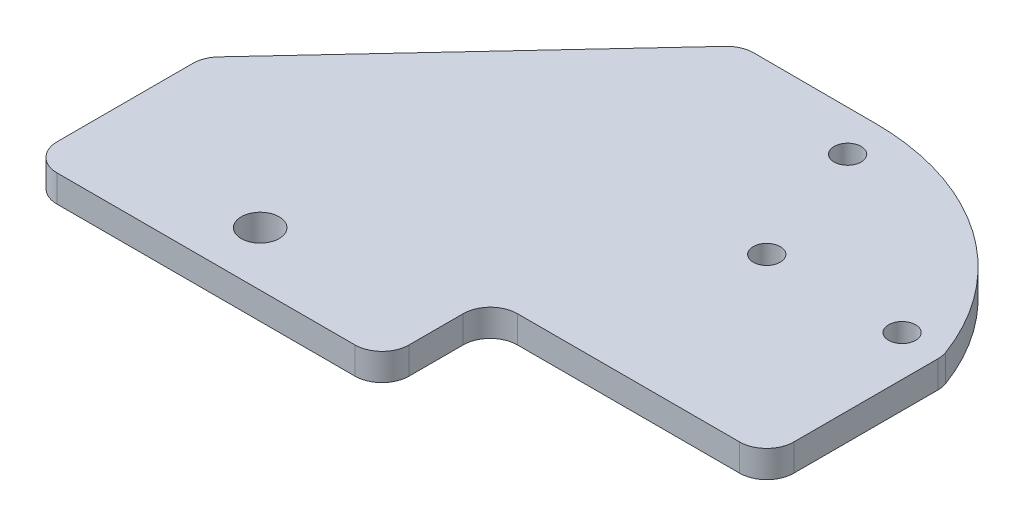
ISO-10303-21;
HEADER;
FILE_DESCRIPTION(('STEP AP214'),'2;1');
FILE_NAME('part.step','',(''),(''),'','','');
FILE_SCHEMA(('AUTOMOTIVE_DESIGN { 1 0 10303 214 1 1 1 1 }'));
ENDSEC;
DATA;
#1=APPLICATION_CONTEXT('core data for automotive mechanical design processes');
#2=APPLICATION_PROTOCOL_DEFINITION('international standard','automotive_design',2000,#1);
#3=PRODUCT_CONTEXT('',#1,'mechanical');
#4=PRODUCT('Part','Part','',(#3));
#5=PRODUCT_RELATED_PRODUCT_CATEGORY('part','',(#4));
#6=PRODUCT_DEFINITION_FORMATION('','',#4);
#7=PRODUCT_DEFINITION_CONTEXT('part definition',#1,'design');
#8=PRODUCT_DEFINITION('design','',#6,#7);
#9=PRODUCT_DEFINITION_SHAPE('','',#8);
#10=(LENGTH_UNIT() NAMED_UNIT(*) SI_UNIT(.MILLI.,.METRE.));
#11=(NAMED_UNIT(*) PLANE_ANGLE_UNIT() SI_UNIT($,.RADIAN.));
#12=(NAMED_UNIT(*) SI_UNIT($,.STERADIAN.) SOLID_ANGLE_UNIT());
#13=UNCERTAINTY_MEASURE_WITH_UNIT(LENGTH_MEASURE(1.E-05),#10,'distance_accuracy_value','');
#14=(GEOMETRIC_REPRESENTATION_CONTEXT(3) GLOBAL_UNCERTAINTY_ASSIGNED_CONTEXT((#13)) GLOBAL_UNIT_ASSIGNED_CONTEXT((#10,
#11,#12)) REPRESENTATION_CONTEXT('',''));
#15=CARTESIAN_POINT('',(0.,0.,0.));
#16=DIRECTION('',(0.,0.,1.));
#17=DIRECTION('',(1.,0.,0.));
#18=AXIS2_PLACEMENT_3D('',#15,#16,#17);
#19=CARTESIAN_POINT('',(-34.7983001151033,10.,-117.080751783085));
#20=DIRECTION('',(0.,-1.,0.));
#21=DIRECTION('',(0.,0.,-1.));
#22=AXIS2_PLACEMENT_3D('',#19,#20,#21);
#23=CYLINDRICAL_SURFACE('',#22,9.99999999999999);
#24=CARTESIAN_POINT('',(-34.7983001151033,0.,-117.080751783085));
#25=DIRECTION('',(0.,1.,0.));
#26=DIRECTION('',(0.,0.,-1.));
#27=AXIS2_PLACEMENT_3D('',#24,#25,#26);
#28=CIRCLE('',#27,9.99999999999999);
#29=CARTESIAN_POINT('',(-34.7740073455693,0.,-127.080722276109));
#30=VERTEX_POINT('',#29);
#31=CARTESIAN_POINT('',(-42.1194135361715,0.,-123.892601625518));
#32=VERTEX_POINT('',#31);
#33=EDGE_CURVE('E181',#30,#32,#28,.T.);
#34=ORIENTED_EDGE('',*,*,#33,.T.);
#35=DIRECTION('',(0.,-1.,0.));
#36=VECTOR('',#35,1.);
#37=CARTESIAN_POINT('',(-42.1194135361715,10.,-123.892601625518));
#38=LINE('',#37,#36);
#39=CARTESIAN_POINT('',(-42.1194135361715,10.,-123.892601625518));
#40=VERTEX_POINT('',#39);
#41=EDGE_CURVE('E11',#40,#32,#38,.T.);
#42=ORIENTED_EDGE('',*,*,#41,.F.);
#43=CARTESIAN_POINT('',(-34.7983001151033,10.,-117.080751783085));
#44=DIRECTION('',(0.,1.,0.));
#45=DIRECTION('',(0.,0.,-1.));
#46=AXIS2_PLACEMENT_3D('',#43,#44,#45);
#47=CIRCLE('',#46,9.99999999999999);
#48=CARTESIAN_POINT('',(-34.7740073455693,10.,-127.080722276109));
#49=VERTEX_POINT('',#48);
#50=EDGE_CURVE('E211',#49,#40,#47,.T.);
#51=ORIENTED_EDGE('',*,*,#50,.F.);
#52=DIRECTION('',(0.,-1.,0.));
#53=VECTOR('',#52,1.);
#54=CARTESIAN_POINT('',(-34.7740073455693,10.,-127.080722276109));
#55=LINE('',#54,#53);
#56=EDGE_CURVE('E177',#49,#30,#55,.T.);
#57=ORIENTED_EDGE('',*,*,#56,.T.);
#58=EDGE_LOOP('',(#34,#42,#51,#57));
#59=FACE_BOUND('',#58,.T.);
#60=ADVANCED_FACE('F35',(#59),#23,.T.);
#61=CARTESIAN_POINT('',(-132.321113421068,10.,-26.9472944173652));
#62=DIRECTION('',(0.732111342106818,0.,0.681184984243307));
#63=DIRECTION('',(0.681184984243307,0.,-0.732111342106818));
#64=AXIS2_PLACEMENT_3D('',#61,#62,#63);
#65=PLANE('',#64);
#66=DIRECTION('',(-0.681184984243307,0.,0.732111342106818));
#67=VECTOR('',#66,1.);
#68=CARTESIAN_POINT('',(-132.321113421068,0.,-26.9472944173652));
#69=LINE('',#68,#67);
#70=CARTESIAN_POINT('',(-132.321113421068,0.,-26.9472944173652));
#71=VERTEX_POINT('',#70);
#72=EDGE_CURVE('E184',#32,#71,#69,.T.);
#73=ORIENTED_EDGE('',*,*,#72,.T.);
#74=DIRECTION('',(0.,-1.,0.));
#75=VECTOR('',#74,1.);
#76=CARTESIAN_POINT('',(-132.321113421068,10.,-26.9472944173652));
#77=LINE('',#76,#75);
#78=CARTESIAN_POINT('',(-132.321113421068,10.,-26.9472944173652));
#79=VERTEX_POINT('',#78);
#80=EDGE_CURVE('E44',#79,#71,#77,.T.);
#81=ORIENTED_EDGE('',*,*,#80,.F.);
#82=DIRECTION('',(-0.681184984243307,0.,0.732111342106818));
#83=VECTOR('',#82,1.);
#84=CARTESIAN_POINT('',(-132.321113421068,10.,-26.9472944173652));
#85=LINE('',#84,#83);
#86=EDGE_CURVE('E120',#40,#79,#85,.T.);
#87=ORIENTED_EDGE('',*,*,#86,.F.);
#88=ORIENTED_EDGE('',*,*,#41,.T.);
#89=EDGE_LOOP('',(#73,#81,#87,#88));
#90=FACE_BOUND('',#89,.T.);
#91=ADVANCED_FACE('F285',(#90),#65,.F.);
#92=CARTESIAN_POINT('',(-125.,10.,-20.1354445749322));
#93=DIRECTION('',(0.,-1.,0.));
#94=DIRECTION('',(0.,0.,-1.));
#95=AXIS2_PLACEMENT_3D('',#92,#93,#94);
#96=CYLINDRICAL_SURFACE('',#95,9.99999999999999);
#97=CARTESIAN_POINT('',(-125.,0.,-20.1354445749322));
#98=DIRECTION('',(0.,1.,0.));
#99=DIRECTION('',(0.,0.,-1.));
#100=AXIS2_PLACEMENT_3D('',#97,#98,#99);
#101=CIRCLE('',#100,9.99999999999999);
#102=CARTESIAN_POINT('',(-135.,0.,-20.1354445749321));
#103=VERTEX_POINT('',#102);
#104=EDGE_CURVE('E186',#71,#103,#101,.T.);
#105=ORIENTED_EDGE('',*,*,#104,.T.);
#106=DIRECTION('',(0.,-1.,0.));
#107=VECTOR('',#106,1.);
#108=CARTESIAN_POINT('',(-135.,10.,-20.1354445749321));
#109=LINE('',#108,#107);
#110=CARTESIAN_POINT('',(-135.,10.,-20.1354445749321));
#111=VERTEX_POINT('',#110);
#112=EDGE_CURVE('E242',#111,#103,#109,.T.);
#113=ORIENTED_EDGE('',*,*,#112,.F.);
#114=CARTESIAN_POINT('',(-125.,10.,-20.1354445749322));
#115=DIRECTION('',(0.,1.,0.));
#116=DIRECTION('',(0.,0.,-1.));
#117=AXIS2_PLACEMENT_3D('',#114,#115,#116);
#118=CIRCLE('',#117,9.99999999999999);
#119=EDGE_CURVE('E421',#79,#111,#118,.T.);
#120=ORIENTED_EDGE('',*,*,#119,.F.);
#121=ORIENTED_EDGE('',*,*,#80,.T.);
#122=EDGE_LOOP('',(#105,#113,#120,#121));
#123=FACE_BOUND('',#122,.T.);
#124=ADVANCED_FACE('F289',(#123),#96,.T.);
#125=CARTESIAN_POINT('',(-135.,10.,30.0000000000002));
#126=DIRECTION('',(1.,0.,0.));
#127=DIRECTION('',(0.,0.,-1.));
#128=AXIS2_PLACEMENT_3D('',#125,#126,#127);
#129=PLANE('',#128);
#130=DIRECTION('',(0.,0.,1.));
#131=VECTOR('',#130,1.);
#132=CARTESIAN_POINT('',(-135.,0.,30.0000000000002));
#133=LINE('',#132,#131);
#134=CARTESIAN_POINT('',(-135.,0.,30.0000000000002));
#135=VERTEX_POINT('',#134);
#136=EDGE_CURVE('E188',#103,#135,#133,.T.);
#137=ORIENTED_EDGE('',*,*,#136,.T.);
#138=DIRECTION('',(0.,-1.,0.));
#139=VECTOR('',#138,1.);
#140=CARTESIAN_POINT('',(-135.,10.,30.0000000000002));
#141=LINE('',#140,#139);
#142=CARTESIAN_POINT('',(-135.,10.,30.0000000000002));
#143=VERTEX_POINT('',#142);
#144=EDGE_CURVE('E239',#143,#135,#141,.T.);
#145=ORIENTED_EDGE('',*,*,#144,.F.);
#146=DIRECTION('',(0.,0.,1.));
#147=VECTOR('',#146,1.);
#148=CARTESIAN_POINT('',(-135.,10.,30.0000000000002));
#149=LINE('',#148,#147);
#150=EDGE_CURVE('E423',#111,#143,#149,.T.);
#151=ORIENTED_EDGE('',*,*,#150,.F.);
#152=ORIENTED_EDGE('',*,*,#112,.T.);
#153=EDGE_LOOP('',(#137,#145,#151,#152));
#154=FACE_BOUND('',#153,.T.);
#155=ADVANCED_FACE('F293',(#154),#129,.F.);
#156=CARTESIAN_POINT('',(-125.,10.,30.0000000000002));
#157=DIRECTION('',(0.,-1.,0.));
#158=DIRECTION('',(0.,0.,-1.));
#159=AXIS2_PLACEMENT_3D('',#156,#157,#158);
#160=CYLINDRICAL_SURFACE('',#159,10.);
#161=CARTESIAN_POINT('',(-125.,0.,30.0000000000002));
#162=DIRECTION('',(0.,1.,0.));
#163=DIRECTION('',(0.,0.,-1.));
#164=AXIS2_PLACEMENT_3D('',#161,#162,#163);
#165=CIRCLE('',#164,10.);
#166=CARTESIAN_POINT('',(-125.,0.,40.0000000000002));
#167=VERTEX_POINT('',#166);
#168=EDGE_CURVE('E190',#135,#167,#165,.T.);
#169=ORIENTED_EDGE('',*,*,#168,.T.);
#170=DIRECTION('',(0.,-1.,0.));
#171=VECTOR('',#170,1.);
#172=CARTESIAN_POINT('',(-125.,10.,40.0000000000002));
#173=LINE('',#172,#171);
#174=CARTESIAN_POINT('',(-125.,10.,40.0000000000002));
#175=VERTEX_POINT('',#174);
#176=EDGE_CURVE('E236',#175,#167,#173,.T.);
#177=ORIENTED_EDGE('',*,*,#176,.F.);
#178=CARTESIAN_POINT('',(-125.,10.,30.0000000000002));
#179=DIRECTION('',(0.,1.,0.));
#180=DIRECTION('',(0.,0.,-1.));
#181=AXIS2_PLACEMENT_3D('',#178,#179,#180);
#182=CIRCLE('',#181,10.);
#183=EDGE_CURVE('E425',#143,#175,#182,.T.);
#184=ORIENTED_EDGE('',*,*,#183,.F.);
#185=ORIENTED_EDGE('',*,*,#144,.T.);
#186=EDGE_LOOP('',(#169,#177,#184,#185));
#187=FACE_BOUND('',#186,.T.);
#188=ADVANCED_FACE('F299',(#187),#160,.T.);
#189=CARTESIAN_POINT('',(-15.0000000000001,10.,40.0000000000002));
#190=DIRECTION('',(0.,0.,-1.));
#191=DIRECTION('',(-1.,0.,0.));
#192=AXIS2_PLACEMENT_3D('',#189,#190,#191);
#193=PLANE('',#192);
#194=DIRECTION('',(1.,0.,0.));
#195=VECTOR('',#194,1.);
#196=CARTESIAN_POINT('',(-15.0000000000001,0.,40.0000000000002));
#197=LINE('',#196,#195);
#198=CARTESIAN_POINT('',(-15.0000000000001,0.,40.0000000000002));
#199=VERTEX_POINT('',#198);
#200=EDGE_CURVE('E192',#167,#199,#197,.T.);
#201=ORIENTED_EDGE('',*,*,#200,.T.);
#202=DIRECTION('',(0.,-1.,0.));
#203=VECTOR('',#202,1.);
#204=CARTESIAN_POINT('',(-15.0000000000001,10.,40.0000000000002));
#205=LINE('',#204,#203);
#206=CARTESIAN_POINT('',(-15.0000000000001,10.,40.0000000000002));
#207=VERTEX_POINT('',#206);
#208=EDGE_CURVE('E233',#207,#199,#205,.T.);
#209=ORIENTED_EDGE('',*,*,#208,.F.);
#210=DIRECTION('',(1.,0.,0.));
#211=VECTOR('',#210,1.);
#212=CARTESIAN_POINT('',(-15.0000000000001,10.,40.0000000000002));
#213=LINE('',#212,#211);
#214=EDGE_CURVE('E427',#175,#207,#213,.T.);
#215=ORIENTED_EDGE('',*,*,#214,.F.);
#216=ORIENTED_EDGE('',*,*,#176,.T.);
#217=EDGE_LOOP('',(#201,#209,#215,#216));
#218=FACE_BOUND('',#217,.T.);
#219=ADVANCED_FACE('F303',(#218),#193,.F.);
#220=CARTESIAN_POINT('',(-15.0000000000001,10.,30.0000000000002));
#221=DIRECTION('',(0.,-1.,0.));
#222=DIRECTION('',(0.,0.,-1.));
#223=AXIS2_PLACEMENT_3D('',#220,#221,#222);
#224=CYLINDRICAL_SURFACE('',#223,10.);
#225=CARTESIAN_POINT('',(-15.0000000000001,0.,30.0000000000002));
#226=DIRECTION('',(0.,1.,0.));
#227=DIRECTION('',(0.,0.,1.));
#228=AXIS2_PLACEMENT_3D('',#225,#226,#227);
#229=CIRCLE('',#228,10.);
#230=CARTESIAN_POINT('',(-5.00000000000007,0.,30.0000000000002));
#231=VERTEX_POINT('',#230);
#232=EDGE_CURVE('E194',#199,#231,#229,.T.);
#233=ORIENTED_EDGE('',*,*,#232,.T.);
#234=DIRECTION('',(0.,-1.,0.));
#235=VECTOR('',#234,1.);
#236=CARTESIAN_POINT('',(-5.00000000000007,10.,30.0000000000002));
#237=LINE('',#236,#235);
#238=CARTESIAN_POINT('',(-5.00000000000007,10.,30.0000000000002));
#239=VERTEX_POINT('',#238);
#240=EDGE_CURVE('E230',#239,#231,#237,.T.);
#241=ORIENTED_EDGE('',*,*,#240,.F.);
#242=CARTESIAN_POINT('',(-15.0000000000001,10.,30.0000000000002));
#243=DIRECTION('',(0.,1.,0.));
#244=DIRECTION('',(0.,0.,1.));
#245=AXIS2_PLACEMENT_3D('',#242,#243,#244);
#246=CIRCLE('',#245,10.);
#247=EDGE_CURVE('E429',#207,#239,#246,.T.);
#248=ORIENTED_EDGE('',*,*,#247,.F.);
#249=ORIENTED_EDGE('',*,*,#208,.T.);
#250=EDGE_LOOP('',(#233,#241,#248,#249));
#251=FACE_BOUND('',#250,.T.);
#252=ADVANCED_FACE('F307',(#251),#224,.T.);
#253=CARTESIAN_POINT('',(-5.00000000000007,10.,10.0000000000001));
#254=DIRECTION('',(-1.,0.,0.));
#255=DIRECTION('',(0.,0.,1.));
#256=AXIS2_PLACEMENT_3D('',#253,#254,#255);
#257=PLANE('',#256);
#258=DIRECTION('',(0.,0.,-1.));
#259=VECTOR('',#258,1.);
#260=CARTESIAN_POINT('',(-5.00000000000007,0.,10.0000000000001));
#261=LINE('',#260,#259);
#262=CARTESIAN_POINT('',(-5.00000000000007,0.,10.0000000000001));
#263=VERTEX_POINT('',#262);
#264=EDGE_CURVE('E196',#231,#263,#261,.T.);
#265=ORIENTED_EDGE('',*,*,#264,.T.);
#266=DIRECTION('',(0.,-1.,0.));
#267=VECTOR('',#266,1.);
#268=CARTESIAN_POINT('',(-5.00000000000007,10.,10.0000000000001));
#269=LINE('',#268,#267);
#270=CARTESIAN_POINT('',(-5.00000000000007,10.,10.0000000000001));
#271=VERTEX_POINT('',#270);
#272=EDGE_CURVE('E227',#271,#263,#269,.T.);
#273=ORIENTED_EDGE('',*,*,#272,.F.);
#274=DIRECTION('',(0.,0.,-1.));
#275=VECTOR('',#274,1.);
#276=CARTESIAN_POINT('',(-5.00000000000007,10.,10.0000000000001));
#277=LINE('',#276,#275);
#278=EDGE_CURVE('E431',#239,#271,#277,.T.);
#279=ORIENTED_EDGE('',*,*,#278,.F.);
#280=ORIENTED_EDGE('',*,*,#240,.T.);
#281=EDGE_LOOP('',(#265,#273,#279,#280));
#282=FACE_BOUND('',#281,.T.);
#283=ADVANCED_FACE('F311',(#282),#257,.F.);
#284=CARTESIAN_POINT('',(4.99999999999992,10.,10.));
#285=DIRECTION('',(0.,-1.,0.));
#286=DIRECTION('',(0.,0.,-1.));
#287=AXIS2_PLACEMENT_3D('',#284,#285,#286);
#288=CYLINDRICAL_SURFACE('',#287,10.);
#289=CARTESIAN_POINT('',(4.99999999999992,0.,10.));
#290=DIRECTION('',(0.,-1.,0.));
#291=DIRECTION('',(0.,0.,-1.));
#292=AXIS2_PLACEMENT_3D('',#289,#290,#291);
#293=CIRCLE('',#292,10.);
#294=CARTESIAN_POINT('',(4.99999999999992,0.,0.));
#295=VERTEX_POINT('',#294);
#296=EDGE_CURVE('E198',#263,#295,#293,.T.);
#297=ORIENTED_EDGE('',*,*,#296,.T.);
#298=DIRECTION('',(0.,-1.,0.));
#299=VECTOR('',#298,1.);
#300=CARTESIAN_POINT('',(4.99999999999992,10.,0.));
#301=LINE('',#300,#299);
#302=CARTESIAN_POINT('',(4.99999999999992,10.,0.));
#303=VERTEX_POINT('',#302);
#304=EDGE_CURVE('E224',#303,#295,#301,.T.);
#305=ORIENTED_EDGE('',*,*,#304,.F.);
#306=CARTESIAN_POINT('',(4.99999999999992,10.,10.));
#307=DIRECTION('',(0.,-1.,0.));
#308=DIRECTION('',(0.,0.,-1.));
#309=AXIS2_PLACEMENT_3D('',#306,#307,#308);
#310=CIRCLE('',#309,10.);
#311=EDGE_CURVE('E433',#271,#303,#310,.T.);
#312=ORIENTED_EDGE('',*,*,#311,.F.);
#313=ORIENTED_EDGE('',*,*,#272,.T.);
#314=EDGE_LOOP('',(#297,#305,#312,#313));
#315=FACE_BOUND('',#314,.T.);
#316=ADVANCED_FACE('F315',(#315),#288,.F.);
#317=CARTESIAN_POINT('',(5.,10.,0.));
#318=DIRECTION('',(0.,0.,-1.));
#319=DIRECTION('',(-1.,0.,0.));
#320=AXIS2_PLACEMENT_3D('',#317,#318,#319);
#321=PLANE('',#320);
#322=DIRECTION('',(1.,0.,0.));
#323=VECTOR('',#322,1.);
#324=CARTESIAN_POINT('',(5.,0.,0.));
#325=LINE('',#324,#323);
#326=CARTESIAN_POINT('',(87.0999999999999,0.,0.));
#327=VERTEX_POINT('',#326);
#328=EDGE_CURVE('E200',#295,#327,#325,.T.);
#329=ORIENTED_EDGE('',*,*,#328,.T.);
#330=DIRECTION('',(0.,-1.,0.));
#331=VECTOR('',#330,1.);
#332=CARTESIAN_POINT('',(87.0999999999999,10.,0.));
#333=LINE('',#332,#331);
#334=CARTESIAN_POINT('',(87.0999999999999,10.,0.));
#335=VERTEX_POINT('',#334);
#336=EDGE_CURVE('E221',#335,#327,#333,.T.);
#337=ORIENTED_EDGE('',*,*,#336,.F.);
#338=DIRECTION('',(1.,0.,0.));
#339=VECTOR('',#338,1.);
#340=CARTESIAN_POINT('',(5.,10.,0.));
#341=LINE('',#340,#339);
#342=EDGE_CURVE('E435',#303,#335,#341,.T.);
#343=ORIENTED_EDGE('',*,*,#342,.F.);
#344=ORIENTED_EDGE('',*,*,#304,.T.);
#345=EDGE_LOOP('',(#329,#337,#343,#344));
#346=FACE_BOUND('',#345,.T.);
#347=ADVANCED_FACE('F319',(#346),#321,.F.);
#348=CARTESIAN_POINT('',(87.1,10.,-10.));
#349=DIRECTION('',(0.,-1.,0.));
#350=DIRECTION('',(0.,0.,-1.));
#351=AXIS2_PLACEMENT_3D('',#348,#349,#350);
#352=CYLINDRICAL_SURFACE('',#351,10.);
#353=CARTESIAN_POINT('',(87.1,0.,-10.));
#354=DIRECTION('',(0.,1.,0.));
#355=DIRECTION('',(0.,0.,1.));
#356=AXIS2_PLACEMENT_3D('',#353,#354,#355);
#357=CIRCLE('',#356,10.);
#358=CARTESIAN_POINT('',(97.1,0.,-10.0000000000001));
#359=VERTEX_POINT('',#358);
#360=EDGE_CURVE('E202',#327,#359,#357,.T.);
#361=ORIENTED_EDGE('',*,*,#360,.T.);
#362=DIRECTION('',(0.,-1.,0.));
#363=VECTOR('',#362,1.);
#364=CARTESIAN_POINT('',(97.1,10.,-10.0000000000001));
#365=LINE('',#364,#363);
#366=CARTESIAN_POINT('',(97.1,10.,-10.0000000000001));
#367=VERTEX_POINT('',#366);
#368=EDGE_CURVE('E218',#367,#359,#365,.T.);
#369=ORIENTED_EDGE('',*,*,#368,.F.);
#370=CARTESIAN_POINT('',(87.1,10.,-10.));
#371=DIRECTION('',(0.,1.,0.));
#372=DIRECTION('',(0.,0.,1.));
#373=AXIS2_PLACEMENT_3D('',#370,#371,#372);
#374=CIRCLE('',#373,10.);
#375=EDGE_CURVE('E437',#335,#367,#374,.T.);
#376=ORIENTED_EDGE('',*,*,#375,.F.);
#377=ORIENTED_EDGE('',*,*,#336,.T.);
#378=EDGE_LOOP('',(#361,#369,#376,#377));
#379=FACE_BOUND('',#378,.T.);
#380=ADVANCED_FACE('F323',(#379),#352,.T.);
#381=CARTESIAN_POINT('',(97.1,10.,-10.0000000000001));
#382=DIRECTION('',(-1.,0.,0.));
#383=DIRECTION('',(0.,0.,1.));
#384=AXIS2_PLACEMENT_3D('',#381,#382,#383);
#385=PLANE('',#384);
#386=DIRECTION('',(0.,0.,-1.));
#387=VECTOR('',#386,1.);
#388=CARTESIAN_POINT('',(97.1,0.,-10.0000000000001));
#389=LINE('',#388,#387);
#390=CARTESIAN_POINT('',(97.1,0.,-63.2667994650932));
#391=VERTEX_POINT('',#390);
#392=EDGE_CURVE('E204',#359,#391,#389,.T.);
#393=ORIENTED_EDGE('',*,*,#392,.T.);
#394=DIRECTION('',(0.,-1.,0.));
#395=VECTOR('',#394,1.);
#396=CARTESIAN_POINT('',(97.1,10.,-63.2667994650932));
#397=LINE('',#396,#395);
#398=CARTESIAN_POINT('',(97.1,10.,-63.2667994650932));
#399=VERTEX_POINT('',#398);
#400=EDGE_CURVE('E215',#399,#391,#397,.T.);
#401=ORIENTED_EDGE('',*,*,#400,.F.);
#402=DIRECTION('',(0.,0.,-1.));
#403=VECTOR('',#402,1.);
#404=CARTESIAN_POINT('',(97.1,10.,-10.0000000000001));
#405=LINE('',#404,#403);
#406=EDGE_CURVE('E439',#367,#399,#405,.T.);
#407=ORIENTED_EDGE('',*,*,#406,.F.);
#408=ORIENTED_EDGE('',*,*,#368,.T.);
#409=EDGE_LOOP('',(#393,#401,#407,#408));
#410=FACE_BOUND('',#409,.T.);
#411=ADVANCED_FACE('F327',(#410),#385,.F.);
#412=CARTESIAN_POINT('',(87.1,10.,-63.2667994650932));
#413=DIRECTION('',(0.,-1.,0.));
#414=DIRECTION('',(0.,0.,-1.));
#415=AXIS2_PLACEMENT_3D('',#412,#413,#414);
#416=CYLINDRICAL_SURFACE('',#415,9.99999999999999);
#417=CARTESIAN_POINT('',(87.1,0.,-63.2667994650932));
#418=DIRECTION('',(0.,1.,0.));
#419=DIRECTION('',(0.,0.,-1.));
#420=AXIS2_PLACEMENT_3D('',#417,#418,#419);
#421=CIRCLE('',#420,9.99999999999999);
#422=CARTESIAN_POINT('',(96.4817618721916,0.,-66.7283806317701));
#423=VERTEX_POINT('',#422);
#424=EDGE_CURVE('E206',#391,#423,#421,.T.);
#425=ORIENTED_EDGE('',*,*,#424,.T.);
#426=DIRECTION('',(0.,-1.,0.));
#427=VECTOR('',#426,1.);
#428=CARTESIAN_POINT('',(96.4817618721916,10.,-66.7283806317701));
#429=LINE('',#428,#427);
#430=CARTESIAN_POINT('',(96.4817618721916,10.,-66.7283806317701));
#431=VERTEX_POINT('',#430);
#432=EDGE_CURVE('E172',#431,#423,#429,.T.);
#433=ORIENTED_EDGE('',*,*,#432,.F.);
#434=CARTESIAN_POINT('',(87.1,10.,-63.2667994650932));
#435=DIRECTION('',(0.,1.,0.));
#436=DIRECTION('',(0.,0.,-1.));
#437=AXIS2_PLACEMENT_3D('',#434,#435,#436);
#438=CIRCLE('',#437,9.99999999999999);
#439=EDGE_CURVE('E163',#399,#431,#438,.T.);
#440=ORIENTED_EDGE('',*,*,#439,.F.);
#441=ORIENTED_EDGE('',*,*,#400,.T.);
#442=EDGE_LOOP('',(#425,#433,#440,#441));
#443=FACE_BOUND('',#442,.T.);
#444=ADVANCED_FACE('F331',(#443),#416,.T.);
#445=CARTESIAN_POINT('',(9.99999999999992,10.,-34.8192741935483));
#446=DIRECTION('',(0.,-1.,0.));
#447=DIRECTION('',(0.,0.,-1.));
#448=AXIS2_PLACEMENT_3D('',#445,#446,#447);
#449=CYLINDRICAL_SURFACE('',#448,92.1807258064517);
#450=CARTESIAN_POINT('',(9.99999999999992,0.,-34.8192741935483));
#451=DIRECTION('',(0.,1.,0.));
#452=DIRECTION('',(0.,0.,-1.));
#453=AXIS2_PLACEMENT_3D('',#450,#451,#452);
#454=CIRCLE('',#453,92.1807258064517);
#455=CARTESIAN_POINT('',(9.99999999999993,0.,-127.));
#456=VERTEX_POINT('',#455);
#457=EDGE_CURVE('E171',#423,#456,#454,.T.);
#458=ORIENTED_EDGE('',*,*,#457,.T.);
#459=DIRECTION('',(0.,-1.,0.));
#460=VECTOR('',#459,1.);
#461=CARTESIAN_POINT('',(9.99999999999993,10.,-127.));
#462=LINE('',#461,#460);
#463=CARTESIAN_POINT('',(9.99999999999993,10.,-127.));
#464=VERTEX_POINT('',#463);
#465=EDGE_CURVE('E168',#464,#456,#462,.T.);
#466=ORIENTED_EDGE('',*,*,#465,.F.);
#467=CARTESIAN_POINT('',(9.99999999999992,10.,-34.8192741935483));
#468=DIRECTION('',(0.,1.,0.));
#469=DIRECTION('',(0.,0.,-1.));
#470=AXIS2_PLACEMENT_3D('',#467,#468,#469);
#471=CIRCLE('',#470,92.1807258064517);
#472=EDGE_CURVE('E157',#431,#464,#471,.T.);
#473=ORIENTED_EDGE('',*,*,#472,.F.);
#474=ORIENTED_EDGE('',*,*,#432,.T.);
#475=EDGE_LOOP('',(#458,#466,#473,#474));
#476=FACE_BOUND('',#475,.T.);
#477=ADVANCED_FACE('F169',(#476),#449,.T.);
#478=CARTESIAN_POINT('',(-1.54517445824721,10.,-127.));
#479=DIRECTION('',(0.,0.,1.));
#480=DIRECTION('',(1.,0.,0.));
#481=AXIS2_PLACEMENT_3D('',#478,#479,#480);
#482=PLANE('',#481);
#483=DIRECTION('',(-1.,0.,0.));
#484=VECTOR('',#483,1.);
#485=CARTESIAN_POINT('',(-1.54517445824721,0.,-127.));
#486=LINE('',#485,#484);
#487=CARTESIAN_POINT('',(-1.54517445824721,0.,-127.));
#488=VERTEX_POINT('',#487);
#489=EDGE_CURVE('E106',#456,#488,#486,.T.);
#490=ORIENTED_EDGE('',*,*,#489,.T.);
#491=DIRECTION('',(0.,-1.,0.));
#492=VECTOR('',#491,1.);
#493=CARTESIAN_POINT('',(-1.54517445824721,10.,-127.));
#494=LINE('',#493,#492);
#495=CARTESIAN_POINT('',(-1.54517445824721,10.,-127.));
#496=VERTEX_POINT('',#495);
#497=EDGE_CURVE('E173',#496,#488,#494,.T.);
#498=ORIENTED_EDGE('',*,*,#497,.F.);
#499=DIRECTION('',(-1.,0.,0.));
#500=VECTOR('',#499,1.);
#501=CARTESIAN_POINT('',(-1.54517445824721,10.,-127.));
#502=LINE('',#501,#500);
#503=EDGE_CURVE('E161',#464,#496,#502,.T.);
#504=ORIENTED_EDGE('',*,*,#503,.F.);
#505=ORIENTED_EDGE('',*,*,#465,.T.);
#506=EDGE_LOOP('',(#490,#498,#504,#505));
#507=FACE_BOUND('',#506,.T.);
#508=ADVANCED_FACE('F175',(#507),#482,.F.);
#509=CARTESIAN_POINT('',(-34.7740073455693,10.,-127.080722276109));
#510=DIRECTION('',(-0.0024292769534094,0.,0.999997049302389));
#511=DIRECTION('',(0.999997049302389,0.,0.0024292769534094));
#512=AXIS2_PLACEMENT_3D('',#509,#510,#511);
#513=PLANE('',#512);
#514=DIRECTION('',(-0.999997049302389,0.,-0.0024292769534094));
#515=VECTOR('',#514,1.);
#516=CARTESIAN_POINT('',(-34.7740073455693,0.,-127.080722276109));
#517=LINE('',#516,#515);
#518=EDGE_CURVE('E112',#488,#30,#517,.T.);
#519=ORIENTED_EDGE('',*,*,#518,.T.);
#520=ORIENTED_EDGE('',*,*,#56,.F.);
#521=DIRECTION('',(-0.999997049302389,0.,-0.0024292769534094));
#522=VECTOR('',#521,1.);
#523=CARTESIAN_POINT('',(-34.7740073455693,10.,-127.080722276109));
#524=LINE('',#523,#522);
#525=EDGE_CURVE('E53',#496,#49,#524,.T.);
#526=ORIENTED_EDGE('',*,*,#525,.F.);
#527=ORIENTED_EDGE('',*,*,#497,.T.);
#528=EDGE_LOOP('',(#519,#520,#526,#527));
#529=FACE_BOUND('',#528,.T.);
#530=ADVANCED_FACE('F274',(#529),#513,.F.);
#531=CARTESIAN_POINT('',(-34.7983001151033,10.,-117.080751783085));
#532=DIRECTION('',(0.,-1.,0.));
#533=DIRECTION('',(0.,0.,-1.));
#534=AXIS2_PLACEMENT_3D('',#531,#532,#533);
#535=PLANE('',#534);
#536=CARTESIAN_POINT('',(-70.0000000000001,10.,20.0000000000002));
#537=DIRECTION('',(0.,-1.,0.));
#538=DIRECTION('',(0.,0.,-1.));
#539=AXIS2_PLACEMENT_3D('',#536,#537,#538);
#540=CIRCLE('',#539,7.);
#541=CARTESIAN_POINT('',(-70.0000000000001,10.,13.0000000000002));
#542=VERTEX_POINT('',#541);
#543=EDGE_CURVE('E404',#542,#542,#540,.T.);
#544=ORIENTED_EDGE('',*,*,#543,.T.);
#545=EDGE_LOOP('',(#544));
#546=FACE_BOUND('',#545,.T.);
#547=CARTESIAN_POINT('',(14.9989928337167,10.,-111.984631039295));
#548=DIRECTION('',(0.,1.,0.));
#549=DIRECTION('',(0.,0.,1.));
#550=AXIS2_PLACEMENT_3D('',#547,#548,#549);
#551=CIRCLE('',#550,5.00000000000001);
#552=CARTESIAN_POINT('',(14.9989928337167,10.,-106.984631039295));
#553=VERTEX_POINT('',#552);
#554=EDGE_CURVE('E250',#553,#553,#551,.T.);
#555=ORIENTED_EDGE('',*,*,#554,.F.);
#556=EDGE_LOOP('',(#555));
#557=FACE_BOUND('',#556,.T.);
#558=CARTESIAN_POINT('',(82.1,10.,-65.));
#559=DIRECTION('',(0.,1.,0.));
#560=DIRECTION('',(0.,0.,1.));
#561=AXIS2_PLACEMENT_3D('',#558,#559,#560);
#562=CIRCLE('',#561,5.00000000000001);
#563=CARTESIAN_POINT('',(82.1,10.,-60.));
#564=VERTEX_POINT('',#563);
#565=EDGE_CURVE('E414',#564,#564,#562,.T.);
#566=ORIENTED_EDGE('',*,*,#565,.F.);
#567=EDGE_LOOP('',(#566));
#568=FACE_BOUND('',#567,.T.);
#569=CARTESIAN_POINT('',(32.1,10.,-65.));
#570=DIRECTION('',(0.,1.,0.));
#571=DIRECTION('',(0.,0.,1.));
#572=AXIS2_PLACEMENT_3D('',#569,#570,#571);
#573=CIRCLE('',#572,4.99999999999999);
#574=CARTESIAN_POINT('',(32.1,10.,-60.));
#575=VERTEX_POINT('',#574);
#576=EDGE_CURVE('E409',#575,#575,#573,.T.);
#577=ORIENTED_EDGE('',*,*,#576,.F.);
#578=EDGE_LOOP('',(#577));
#579=FACE_BOUND('',#578,.T.);
#580=ORIENTED_EDGE('',*,*,#50,.T.);
#581=ORIENTED_EDGE('',*,*,#86,.T.);
#582=ORIENTED_EDGE('',*,*,#119,.T.);
#583=ORIENTED_EDGE('',*,*,#150,.T.);
#584=ORIENTED_EDGE('',*,*,#183,.T.);
#585=ORIENTED_EDGE('',*,*,#214,.T.);
#586=ORIENTED_EDGE('',*,*,#247,.T.);
#587=ORIENTED_EDGE('',*,*,#278,.T.);
#588=ORIENTED_EDGE('',*,*,#311,.T.);
#589=ORIENTED_EDGE('',*,*,#342,.T.);
#590=ORIENTED_EDGE('',*,*,#375,.T.);
#591=ORIENTED_EDGE('',*,*,#406,.T.);
#592=ORIENTED_EDGE('',*,*,#439,.T.);
#593=ORIENTED_EDGE('',*,*,#472,.T.);
#594=ORIENTED_EDGE('',*,*,#503,.T.);
#595=ORIENTED_EDGE('',*,*,#525,.T.);
#596=EDGE_LOOP('',(#580,#581,#582,#583,#584,#585,#586,#587,#588,#589,#590,#591,#592,#593,#594,#595));
#597=FACE_BOUND('',#596,.T.);
#598=ADVANCED_FACE('F159',(#546,#557,#568,#579,#597),#535,.F.);
#599=CARTESIAN_POINT('',(-34.7983001151033,0.,-117.080751783085));
#600=DIRECTION('',(0.,-1.,0.));
#601=DIRECTION('',(0.,0.,-1.));
#602=AXIS2_PLACEMENT_3D('',#599,#600,#601);
#603=PLANE('',#602);
#604=CARTESIAN_POINT('',(-70.0000000000001,0.,20.0000000000002));
#605=DIRECTION('',(0.,-1.,0.));
#606=DIRECTION('',(0.,0.,-1.));
#607=AXIS2_PLACEMENT_3D('',#604,#605,#606);
#608=CIRCLE('',#607,7.);
#609=CARTESIAN_POINT('',(-70.0000000000001,0.,13.0000000000002));
#610=VERTEX_POINT('',#609);
#611=EDGE_CURVE('E407',#610,#610,#608,.T.);
#612=ORIENTED_EDGE('',*,*,#611,.F.);
#613=EDGE_LOOP('',(#612));
#614=FACE_BOUND('',#613,.T.);
#615=CARTESIAN_POINT('',(14.9989928337167,0.,-111.984631039295));
#616=DIRECTION('',(0.,-1.,0.));
#617=DIRECTION('',(0.,0.,-1.));
#618=AXIS2_PLACEMENT_3D('',#615,#616,#617);
#619=CIRCLE('',#618,5.00000000000001);
#620=CARTESIAN_POINT('',(14.9989928337167,0.,-106.984631039295));
#621=VERTEX_POINT('',#620);
#622=EDGE_CURVE('E38',#621,#621,#619,.T.);
#623=ORIENTED_EDGE('',*,*,#622,.F.);
#624=EDGE_LOOP('',(#623));
#625=FACE_BOUND('',#624,.T.);
#626=CARTESIAN_POINT('',(82.1,0.,-65.));
#627=DIRECTION('',(0.,-1.,0.));
#628=DIRECTION('',(0.,0.,-1.));
#629=AXIS2_PLACEMENT_3D('',#626,#627,#628);
#630=CIRCLE('',#629,5.00000000000001);
#631=CARTESIAN_POINT('',(82.1,0.,-60.));
#632=VERTEX_POINT('',#631);
#633=EDGE_CURVE('E249',#632,#632,#630,.T.);
#634=ORIENTED_EDGE('',*,*,#633,.F.);
#635=EDGE_LOOP('',(#634));
#636=FACE_BOUND('',#635,.T.);
#637=CARTESIAN_POINT('',(32.1,0.,-65.));
#638=DIRECTION('',(0.,-1.,0.));
#639=DIRECTION('',(0.,0.,-1.));
#640=AXIS2_PLACEMENT_3D('',#637,#638,#639);
#641=CIRCLE('',#640,4.99999999999999);
#642=CARTESIAN_POINT('',(32.1,0.,-60.));
#643=VERTEX_POINT('',#642);
#644=EDGE_CURVE('E247',#643,#643,#641,.T.);
#645=ORIENTED_EDGE('',*,*,#644,.F.);
#646=EDGE_LOOP('',(#645));
#647=FACE_BOUND('',#646,.T.);
#648=ORIENTED_EDGE('',*,*,#33,.F.);
#649=ORIENTED_EDGE('',*,*,#518,.F.);
#650=ORIENTED_EDGE('',*,*,#489,.F.);
#651=ORIENTED_EDGE('',*,*,#457,.F.);
#652=ORIENTED_EDGE('',*,*,#424,.F.);
#653=ORIENTED_EDGE('',*,*,#392,.F.);
#654=ORIENTED_EDGE('',*,*,#360,.F.);
#655=ORIENTED_EDGE('',*,*,#328,.F.);
#656=ORIENTED_EDGE('',*,*,#296,.F.);
#657=ORIENTED_EDGE('',*,*,#264,.F.);
#658=ORIENTED_EDGE('',*,*,#232,.F.);
#659=ORIENTED_EDGE('',*,*,#200,.F.);
#660=ORIENTED_EDGE('',*,*,#168,.F.);
#661=ORIENTED_EDGE('',*,*,#136,.F.);
#662=ORIENTED_EDGE('',*,*,#104,.F.);
#663=ORIENTED_EDGE('',*,*,#72,.F.);
#664=EDGE_LOOP('',(#648,#649,#650,#651,#652,#653,#654,#655,#656,#657,#658,#659,#660,#661,#662,#663));
#665=FACE_BOUND('',#664,.T.);
#666=ADVANCED_FACE('F260',(#614,#625,#636,#647,#665),#603,.T.);
#667=CARTESIAN_POINT('',(32.1,-1.2E-05,-65.));
#668=DIRECTION('',(0.,1.,0.));
#669=DIRECTION('',(0.,0.,1.));
#670=AXIS2_PLACEMENT_3D('',#667,#668,#669);
#671=CYLINDRICAL_SURFACE('',#670,4.99999999999999);
#672=CARTESIAN_POINT('',(32.1,0.,-60.));
#673=CARTESIAN_POINT('',(32.1,0.104166666666667,-60.));
#674=CARTESIAN_POINT('',(32.1,0.208333333333333,-60.));
#675=CARTESIAN_POINT('',(32.1,0.416666666666667,-60.));
#676=CARTESIAN_POINT('',(32.1,0.520833333333333,-60.));
#677=CARTESIAN_POINT('',(32.1,0.729166666666667,-60.));
#678=CARTESIAN_POINT('',(32.1,0.833333333333333,-60.));
#679=CARTESIAN_POINT('',(32.1,1.04166666666667,-60.));
#680=CARTESIAN_POINT('',(32.1,1.14583333333333,-60.));
#681=CARTESIAN_POINT('',(32.1,1.35416666666667,-60.));
#682=CARTESIAN_POINT('',(32.1,1.45833333333333,-60.));
#683=CARTESIAN_POINT('',(32.1,1.66666666666667,-60.));
#684=CARTESIAN_POINT('',(32.1,1.77083333333333,-60.));
#685=CARTESIAN_POINT('',(32.1,1.97916666666667,-60.));
#686=CARTESIAN_POINT('',(32.1,2.08333333333333,-60.));
#687=CARTESIAN_POINT('',(32.1,2.29166666666667,-60.));
#688=CARTESIAN_POINT('',(32.1,2.39583333333333,-60.));
#689=CARTESIAN_POINT('',(32.1,2.60416666666667,-60.));
#690=CARTESIAN_POINT('',(32.1,2.70833333333333,-60.));
#691=CARTESIAN_POINT('',(32.1,2.91666666666667,-60.));
#692=CARTESIAN_POINT('',(32.1,3.02083333333333,-60.));
#693=CARTESIAN_POINT('',(32.1,3.22916666666667,-60.));
#694=CARTESIAN_POINT('',(32.1,3.33333333333333,-60.));
#695=CARTESIAN_POINT('',(32.1,3.54166666666667,-60.));
#696=CARTESIAN_POINT('',(32.1,3.64583333333333,-60.));
#697=CARTESIAN_POINT('',(32.1,3.85416666666667,-60.));
#698=CARTESIAN_POINT('',(32.1,3.95833333333333,-60.));
#699=CARTESIAN_POINT('',(32.1,4.16666666666667,-60.));
#700=CARTESIAN_POINT('',(32.1,4.27083333333333,-60.));
#701=CARTESIAN_POINT('',(32.1,4.47916666666667,-60.));
#702=CARTESIAN_POINT('',(32.1,4.58333333333333,-60.));
#703=CARTESIAN_POINT('',(32.1,4.79166666666667,-60.));
#704=CARTESIAN_POINT('',(32.1,4.89583333333333,-60.));
#705=CARTESIAN_POINT('',(32.1,5.10416666666667,-60.));
#706=CARTESIAN_POINT('',(32.1,5.20833333333333,-60.));
#707=CARTESIAN_POINT('',(32.1,5.41666666666667,-60.));
#708=CARTESIAN_POINT('',(32.1,5.52083333333333,-60.));
#709=CARTESIAN_POINT('',(32.1,5.72916666666667,-60.));
#710=CARTESIAN_POINT('',(32.1,5.83333333333333,-60.));
#711=CARTESIAN_POINT('',(32.1,6.04166666666667,-60.));
#712=CARTESIAN_POINT('',(32.1,6.14583333333333,-60.));
#713=CARTESIAN_POINT('',(32.1,6.35416666666667,-60.));
#714=CARTESIAN_POINT('',(32.1,6.45833333333333,-60.));
#715=CARTESIAN_POINT('',(32.1,6.66666666666667,-60.));
#716=CARTESIAN_POINT('',(32.1,6.77083333333333,-60.));
#717=CARTESIAN_POINT('',(32.1,6.97916666666667,-60.));
#718=CARTESIAN_POINT('',(32.1,7.08333333333333,-60.));
#719=CARTESIAN_POINT('',(32.1,7.29166666666667,-60.));
#720=CARTESIAN_POINT('',(32.1,7.39583333333333,-60.));
#721=CARTESIAN_POINT('',(32.1,7.60416666666667,-60.));
#722=CARTESIAN_POINT('',(32.1,7.70833333333333,-60.));
#723=CARTESIAN_POINT('',(32.1,7.91666666666667,-60.));
#724=CARTESIAN_POINT('',(32.1,8.02083333333333,-60.));
#725=CARTESIAN_POINT('',(32.1,8.22916666666667,-60.));
#726=CARTESIAN_POINT('',(32.1,8.33333333333333,-60.));
#727=CARTESIAN_POINT('',(32.1,8.54166666666667,-60.));
#728=CARTESIAN_POINT('',(32.1,8.64583333333333,-60.));
#729=CARTESIAN_POINT('',(32.1,8.85416666666667,-60.));
#730=CARTESIAN_POINT('',(32.1,8.95833333333333,-60.));
#731=CARTESIAN_POINT('',(32.1,9.16666666666667,-60.));
#732=CARTESIAN_POINT('',(32.1,9.27083333333333,-60.));
#733=CARTESIAN_POINT('',(32.1,9.47916666666667,-60.));
#734=CARTESIAN_POINT('',(32.1,9.58333333333333,-60.));
#735=CARTESIAN_POINT('',(32.1,9.79166666666667,-60.));
#736=CARTESIAN_POINT('',(32.1,9.89583333333333,-60.));
#737=CARTESIAN_POINT('',(32.1,10.,-60.));
#738=B_SPLINE_CURVE_WITH_KNOTS('',3,(#672,#673,#674,#675,#676,#677,#678,#679,#680,#681,#682,
#683,#684,#685,#686,#687,#688,#689,#690,#691,#692,#693,#694,#695,#696,#697,#698,#699,#700,#701,
#702,#703,#704,#705,#706,#707,#708,#709,#710,#711,#712,#713,#714,#715,#716,#717,#718,#719,#720,
#721,#722,#723,#724,#725,#726,#727,#728,#729,#730,#731,#732,#733,#734,#735,#736,#737),
.UNSPECIFIED.,.F.,.F.,(4,2,2,2,2,2,2,2,2,2,2,2,2,2,2,2,2,2,2,2,2,2,2,2,2,2,2,2,2,2,2,2,4),(0.,
0.3125,0.625,0.9375,1.25,1.5625,1.875,2.1875,2.5,2.8125,3.125,3.4375,3.75,4.0625,4.375,4.6875,
5.,5.3125,5.625,5.9375,6.25,6.5625,6.875,7.1875,7.5,7.8125,8.125,8.4375,8.75,9.0625,9.375,
9.6875,10.),.UNSPECIFIED.);
#739=EDGE_CURVE('BSEAM263',#643,#575,#738,.T.);
#740=ORIENTED_EDGE('',*,*,#644,.T.);
#741=ORIENTED_EDGE('',*,*,#576,.T.);
#742=ORIENTED_EDGE('',*,*,#739,.T.);
#743=ORIENTED_EDGE('',*,*,#739,.F.);
#744=EDGE_LOOP('',(#740,#742,#741,#743));
#745=FACE_BOUND('',#744,.T.);
#746=ADVANCED_FACE('F263',(#745),#671,.F.);
#747=CARTESIAN_POINT('',(82.1,-1.2E-05,-65.));
#748=DIRECTION('',(0.,1.,0.));
#749=DIRECTION('',(0.,0.,1.));
#750=AXIS2_PLACEMENT_3D('',#747,#748,#749);
#751=CYLINDRICAL_SURFACE('',#750,5.00000000000001);
#752=CARTESIAN_POINT('',(82.1,0.,-60.));
#753=CARTESIAN_POINT('',(82.1,0.104166666666667,-60.));
#754=CARTESIAN_POINT('',(82.1,0.208333333333333,-60.));
#755=CARTESIAN_POINT('',(82.1,0.416666666666667,-60.));
#756=CARTESIAN_POINT('',(82.1,0.520833333333333,-60.));
#757=CARTESIAN_POINT('',(82.1,0.729166666666667,-60.));
#758=CARTESIAN_POINT('',(82.1,0.833333333333333,-60.));
#759=CARTESIAN_POINT('',(82.1,1.04166666666667,-60.));
#760=CARTESIAN_POINT('',(82.1,1.14583333333333,-60.));
#761=CARTESIAN_POINT('',(82.1,1.35416666666667,-60.));
#762=CARTESIAN_POINT('',(82.1,1.45833333333333,-60.));
#763=CARTESIAN_POINT('',(82.1,1.66666666666667,-60.));
#764=CARTESIAN_POINT('',(82.1,1.77083333333333,-60.));
#765=CARTESIAN_POINT('',(82.1,1.97916666666667,-60.));
#766=CARTESIAN_POINT('',(82.1,2.08333333333333,-60.));
#767=CARTESIAN_POINT('',(82.1,2.29166666666667,-60.));
#768=CARTESIAN_POINT('',(82.1,2.39583333333333,-60.));
#769=CARTESIAN_POINT('',(82.1,2.60416666666667,-60.));
#770=CARTESIAN_POINT('',(82.1,2.70833333333333,-60.));
#771=CARTESIAN_POINT('',(82.1,2.91666666666667,-60.));
#772=CARTESIAN_POINT('',(82.1,3.02083333333333,-60.));
#773=CARTESIAN_POINT('',(82.1,3.22916666666667,-60.));
#774=CARTESIAN_POINT('',(82.1,3.33333333333333,-60.));
#775=CARTESIAN_POINT('',(82.1,3.54166666666667,-60.));
#776=CARTESIAN_POINT('',(82.1,3.64583333333333,-60.));
#777=CARTESIAN_POINT('',(82.1,3.85416666666667,-60.));
#778=CARTESIAN_POINT('',(82.1,3.95833333333333,-60.));
#779=CARTESIAN_POINT('',(82.1,4.16666666666667,-60.));
#780=CARTESIAN_POINT('',(82.1,4.27083333333333,-60.));
#781=CARTESIAN_POINT('',(82.1,4.47916666666667,-60.));
#782=CARTESIAN_POINT('',(82.1,4.58333333333333,-60.));
#783=CARTESIAN_POINT('',(82.1,4.79166666666667,-60.));
#784=CARTESIAN_POINT('',(82.1,4.89583333333333,-60.));
#785=CARTESIAN_POINT('',(82.1,5.10416666666667,-60.));
#786=CARTESIAN_POINT('',(82.1,5.20833333333333,-60.));
#787=CARTESIAN_POINT('',(82.1,5.41666666666667,-60.));
#788=CARTESIAN_POINT('',(82.1,5.52083333333333,-60.));
#789=CARTESIAN_POINT('',(82.1,5.72916666666667,-60.));
#790=CARTESIAN_POINT('',(82.1,5.83333333333333,-60.));
#791=CARTESIAN_POINT('',(82.1,6.04166666666667,-60.));
#792=CARTESIAN_POINT('',(82.1,6.14583333333333,-60.));
#793=CARTESIAN_POINT('',(82.1,6.35416666666667,-60.));
#794=CARTESIAN_POINT('',(82.1,6.45833333333333,-60.));
#795=CARTESIAN_POINT('',(82.1,6.66666666666667,-60.));
#796=CARTESIAN_POINT('',(82.1,6.77083333333333,-60.));
#797=CARTESIAN_POINT('',(82.1,6.97916666666667,-60.));
#798=CARTESIAN_POINT('',(82.1,7.08333333333333,-60.));
#799=CARTESIAN_POINT('',(82.1,7.29166666666667,-60.));
#800=CARTESIAN_POINT('',(82.1,7.39583333333333,-60.));
#801=CARTESIAN_POINT('',(82.1,7.60416666666667,-60.));
#802=CARTESIAN_POINT('',(82.1,7.70833333333333,-60.));
#803=CARTESIAN_POINT('',(82.1,7.91666666666667,-60.));
#804=CARTESIAN_POINT('',(82.1,8.02083333333333,-60.));
#805=CARTESIAN_POINT('',(82.1,8.22916666666667,-60.));
#806=CARTESIAN_POINT('',(82.1,8.33333333333333,-60.));
#807=CARTESIAN_POINT('',(82.1,8.54166666666667,-60.));
#808=CARTESIAN_POINT('',(82.1,8.64583333333333,-60.));
#809=CARTESIAN_POINT('',(82.1,8.85416666666667,-60.));
#810=CARTESIAN_POINT('',(82.1,8.95833333333333,-60.));
#811=CARTESIAN_POINT('',(82.1,9.16666666666667,-60.));
#812=CARTESIAN_POINT('',(82.1,9.27083333333333,-60.));
#813=CARTESIAN_POINT('',(82.1,9.47916666666667,-60.));
#814=CARTESIAN_POINT('',(82.1,9.58333333333333,-60.));
#815=CARTESIAN_POINT('',(82.1,9.79166666666667,-60.));
#816=CARTESIAN_POINT('',(82.1,9.89583333333333,-60.));
#817=CARTESIAN_POINT('',(82.1,10.,-60.));
#818=B_SPLINE_CURVE_WITH_KNOTS('',3,(#752,#753,#754,#755,#756,#757,#758,#759,#760,#761,#762,
#763,#764,#765,#766,#767,#768,#769,#770,#771,#772,#773,#774,#775,#776,#777,#778,#779,#780,#781,
#782,#783,#784,#785,#786,#787,#788,#789,#790,#791,#792,#793,#794,#795,#796,#797,#798,#799,#800,
#801,#802,#803,#804,#805,#806,#807,#808,#809,#810,#811,#812,#813,#814,#815,#816,#817),
.UNSPECIFIED.,.F.,.F.,(4,2,2,2,2,2,2,2,2,2,2,2,2,2,2,2,2,2,2,2,2,2,2,2,2,2,2,2,2,2,2,2,4),(0.,
0.3125,0.625,0.9375,1.25,1.5625,1.875,2.1875,2.5,2.8125,3.125,3.4375,3.75,4.0625,4.375,4.6875,
5.,5.3125,5.625,5.9375,6.25,6.5625,6.875,7.1875,7.5,7.8125,8.125,8.4375,8.75,9.0625,9.375,
9.6875,10.),.UNSPECIFIED.);
#819=EDGE_CURVE('BSEAM359',#632,#564,#818,.T.);
#820=ORIENTED_EDGE('',*,*,#633,.T.);
#821=ORIENTED_EDGE('',*,*,#565,.T.);
#822=ORIENTED_EDGE('',*,*,#819,.T.);
#823=ORIENTED_EDGE('',*,*,#819,.F.);
#824=EDGE_LOOP('',(#820,#822,#821,#823));
#825=FACE_BOUND('',#824,.T.);
#826=ADVANCED_FACE('F359',(#825),#751,.F.);
#827=CARTESIAN_POINT('',(14.9989928337167,-1.2E-05,-111.984631039295));
#828=DIRECTION('',(0.,1.,0.));
#829=DIRECTION('',(0.,0.,1.));
#830=AXIS2_PLACEMENT_3D('',#827,#828,#829);
#831=CYLINDRICAL_SURFACE('',#830,5.00000000000001);
#832=CARTESIAN_POINT('',(14.9989928337167,0.,-106.984631039295));
#833=CARTESIAN_POINT('',(14.9989928337167,0.104166666666667,-106.984631039295));
#834=CARTESIAN_POINT('',(14.9989928337167,0.208333333333333,-106.984631039295));
#835=CARTESIAN_POINT('',(14.9989928337167,0.416666666666667,-106.984631039295));
#836=CARTESIAN_POINT('',(14.9989928337167,0.520833333333333,-106.984631039295));
#837=CARTESIAN_POINT('',(14.9989928337167,0.729166666666667,-106.984631039295));
#838=CARTESIAN_POINT('',(14.9989928337167,0.833333333333333,-106.984631039295));
#839=CARTESIAN_POINT('',(14.9989928337167,1.04166666666667,-106.984631039295));
#840=CARTESIAN_POINT('',(14.9989928337167,1.14583333333333,-106.984631039295));
#841=CARTESIAN_POINT('',(14.9989928337167,1.35416666666667,-106.984631039295));
#842=CARTESIAN_POINT('',(14.9989928337167,1.45833333333333,-106.984631039295));
#843=CARTESIAN_POINT('',(14.9989928337167,1.66666666666667,-106.984631039295));
#844=CARTESIAN_POINT('',(14.9989928337167,1.77083333333333,-106.984631039295));
#845=CARTESIAN_POINT('',(14.9989928337167,1.97916666666667,-106.984631039295));
#846=CARTESIAN_POINT('',(14.9989928337167,2.08333333333333,-106.984631039295));
#847=CARTESIAN_POINT('',(14.9989928337167,2.29166666666667,-106.984631039295));
#848=CARTESIAN_POINT('',(14.9989928337167,2.39583333333333,-106.984631039295));
#849=CARTESIAN_POINT('',(14.9989928337167,2.60416666666667,-106.984631039295));
#850=CARTESIAN_POINT('',(14.9989928337167,2.70833333333333,-106.984631039295));
#851=CARTESIAN_POINT('',(14.9989928337167,2.91666666666667,-106.984631039295));
#852=CARTESIAN_POINT('',(14.9989928337167,3.02083333333333,-106.984631039295));
#853=CARTESIAN_POINT('',(14.9989928337167,3.22916666666667,-106.984631039295));
#854=CARTESIAN_POINT('',(14.9989928337167,3.33333333333333,-106.984631039295));
#855=CARTESIAN_POINT('',(14.9989928337167,3.54166666666667,-106.984631039295));
#856=CARTESIAN_POINT('',(14.9989928337167,3.64583333333333,-106.984631039295));
#857=CARTESIAN_POINT('',(14.9989928337167,3.85416666666667,-106.984631039295));
#858=CARTESIAN_POINT('',(14.9989928337167,3.95833333333333,-106.984631039295));
#859=CARTESIAN_POINT('',(14.9989928337167,4.16666666666667,-106.984631039295));
#860=CARTESIAN_POINT('',(14.9989928337167,4.27083333333333,-106.984631039295));
#861=CARTESIAN_POINT('',(14.9989928337167,4.47916666666667,-106.984631039295));
#862=CARTESIAN_POINT('',(14.9989928337167,4.58333333333333,-106.984631039295));
#863=CARTESIAN_POINT('',(14.9989928337167,4.79166666666667,-106.984631039295));
#864=CARTESIAN_POINT('',(14.9989928337167,4.89583333333333,-106.984631039295));
#865=CARTESIAN_POINT('',(14.9989928337167,5.10416666666667,-106.984631039295));
#866=CARTESIAN_POINT('',(14.9989928337167,5.20833333333333,-106.984631039295));
#867=CARTESIAN_POINT('',(14.9989928337167,5.41666666666667,-106.984631039295));
#868=CARTESIAN_POINT('',(14.9989928337167,5.52083333333333,-106.984631039295));
#869=CARTESIAN_POINT('',(14.9989928337167,5.72916666666667,-106.984631039295));
#870=CARTESIAN_POINT('',(14.9989928337167,5.83333333333333,-106.984631039295));
#871=CARTESIAN_POINT('',(14.9989928337167,6.04166666666667,-106.984631039295));
#872=CARTESIAN_POINT('',(14.9989928337167,6.14583333333333,-106.984631039295));
#873=CARTESIAN_POINT('',(14.9989928337167,6.35416666666667,-106.984631039295));
#874=CARTESIAN_POINT('',(14.9989928337167,6.45833333333333,-106.984631039295));
#875=CARTESIAN_POINT('',(14.9989928337167,6.66666666666667,-106.984631039295));
#876=CARTESIAN_POINT('',(14.9989928337167,6.77083333333333,-106.984631039295));
#877=CARTESIAN_POINT('',(14.9989928337167,6.97916666666667,-106.984631039295));
#878=CARTESIAN_POINT('',(14.9989928337167,7.08333333333333,-106.984631039295));
#879=CARTESIAN_POINT('',(14.9989928337167,7.29166666666667,-106.984631039295));
#880=CARTESIAN_POINT('',(14.9989928337167,7.39583333333333,-106.984631039295));
#881=CARTESIAN_POINT('',(14.9989928337167,7.60416666666667,-106.984631039295));
#882=CARTESIAN_POINT('',(14.9989928337167,7.70833333333333,-106.984631039295));
#883=CARTESIAN_POINT('',(14.9989928337167,7.91666666666667,-106.984631039295));
#884=CARTESIAN_POINT('',(14.9989928337167,8.02083333333333,-106.984631039295));
#885=CARTESIAN_POINT('',(14.9989928337167,8.22916666666667,-106.984631039295));
#886=CARTESIAN_POINT('',(14.9989928337167,8.33333333333333,-106.984631039295));
#887=CARTESIAN_POINT('',(14.9989928337167,8.54166666666667,-106.984631039295));
#888=CARTESIAN_POINT('',(14.9989928337167,8.64583333333333,-106.984631039295));
#889=CARTESIAN_POINT('',(14.9989928337167,8.85416666666667,-106.984631039295));
#890=CARTESIAN_POINT('',(14.9989928337167,8.95833333333333,-106.984631039295));
#891=CARTESIAN_POINT('',(14.9989928337167,9.16666666666667,-106.984631039295));
#892=CARTESIAN_POINT('',(14.9989928337167,9.27083333333333,-106.984631039295));
#893=CARTESIAN_POINT('',(14.9989928337167,9.47916666666667,-106.984631039295));
#894=CARTESIAN_POINT('',(14.9989928337167,9.58333333333333,-106.984631039295));
#895=CARTESIAN_POINT('',(14.9989928337167,9.79166666666667,-106.984631039295));
#896=CARTESIAN_POINT('',(14.9989928337167,9.89583333333333,-106.984631039295));
#897=CARTESIAN_POINT('',(14.9989928337167,10.,-106.984631039295));
#898=B_SPLINE_CURVE_WITH_KNOTS('',3,(#832,#833,#834,#835,#836,#837,#838,#839,#840,#841,#842,
#843,#844,#845,#846,#847,#848,#849,#850,#851,#852,#853,#854,#855,#856,#857,#858,#859,#860,#861,
#862,#863,#864,#865,#866,#867,#868,#869,#870,#871,#872,#873,#874,#875,#876,#877,#878,#879,#880,
#881,#882,#883,#884,#885,#886,#887,#888,#889,#890,#891,#892,#893,#894,#895,#896,#897),
.UNSPECIFIED.,.F.,.F.,(4,2,2,2,2,2,2,2,2,2,2,2,2,2,2,2,2,2,2,2,2,2,2,2,2,2,2,2,2,2,2,2,4),(0.,
0.3125,0.625,0.9375,1.25,1.5625,1.875,2.1875,2.5,2.8125,3.125,3.4375,3.75,4.0625,4.375,4.6875,
5.,5.3125,5.625,5.9375,6.25,6.5625,6.875,7.1875,7.5,7.8125,8.125,8.4375,8.75,9.0625,9.375,
9.6875,10.),.UNSPECIFIED.);
#899=EDGE_CURVE('BSEAM257',#621,#553,#898,.T.);
#900=ORIENTED_EDGE('',*,*,#622,.T.);
#901=ORIENTED_EDGE('',*,*,#554,.T.);
#902=ORIENTED_EDGE('',*,*,#899,.T.);
#903=ORIENTED_EDGE('',*,*,#899,.F.);
#904=EDGE_LOOP('',(#900,#902,#901,#903));
#905=FACE_BOUND('',#904,.T.);
#906=ADVANCED_FACE('F257',(#905),#831,.F.);
#907=CARTESIAN_POINT('',(-70.0000000000001,10.,20.0000000000002));
#908=DIRECTION('',(0.,-1.,0.));
#909=DIRECTION('',(0.,0.,-1.));
#910=AXIS2_PLACEMENT_3D('',#907,#908,#909);
#911=CYLINDRICAL_SURFACE('',#910,7.);
#912=ORIENTED_EDGE('',*,*,#543,.F.);
#913=EDGE_LOOP('',(#912));
#914=FACE_BOUND('',#913,.T.);
#915=ORIENTED_EDGE('',*,*,#611,.T.);
#916=EDGE_LOOP('',(#915));
#917=FACE_BOUND('',#916,.T.);
#918=ADVANCED_FACE('F378',(#914,#917),#911,.F.);
#919=CLOSED_SHELL('',(#60,#91,#124,#155,#188,#219,#252,#283,#316,#347,#380,#411,#444,#477,#508,
#530,#598,#666,#746,#826,#906,#918));
#920=MANIFOLD_SOLID_BREP('B2',#919);
#921=ADVANCED_BREP_SHAPE_REPRESENTATION('',(#18,#920),#14);
#922=SHAPE_DEFINITION_REPRESENTATION(#9,#921);
ENDSEC;
END-ISO-10303-21;
